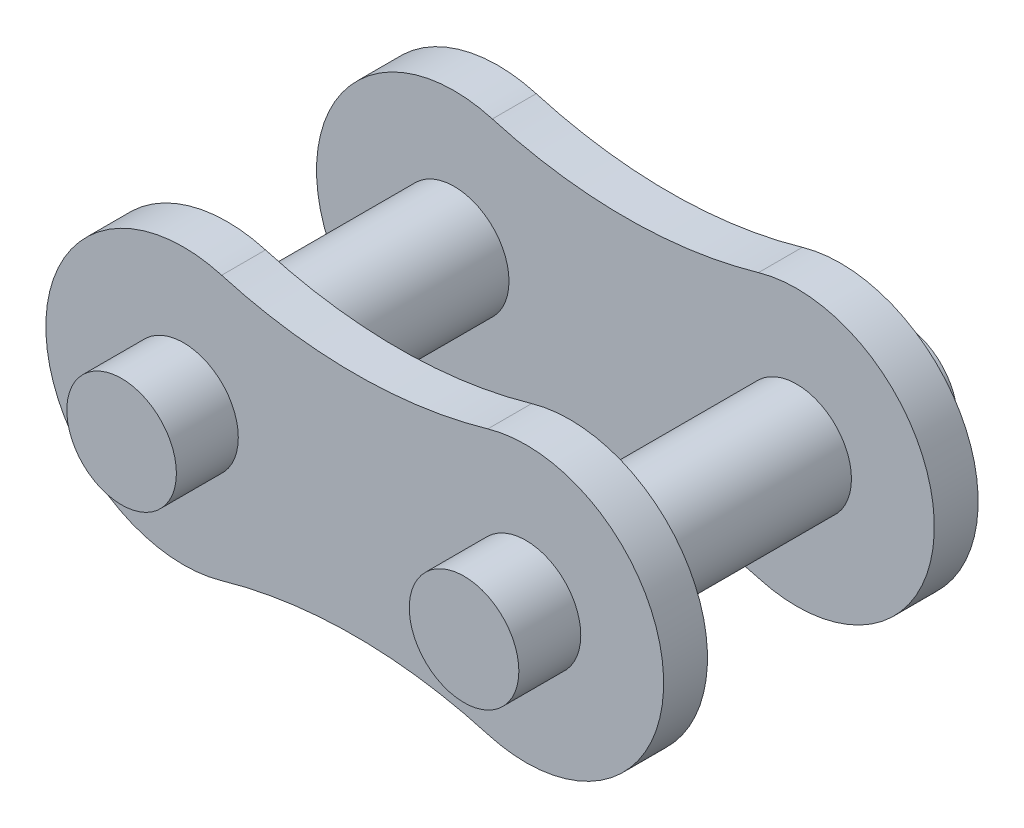
ISO-10303-21;
HEADER;
FILE_DESCRIPTION(('STEP AP214'),'2;1');
FILE_NAME('part.step','',(''),(''),'','','');
FILE_SCHEMA(('AUTOMOTIVE_DESIGN { 1 0 10303 214 1 1 1 1 }'));
ENDSEC;
DATA;
#1=APPLICATION_CONTEXT('core data for automotive mechanical design processes');
#2=APPLICATION_PROTOCOL_DEFINITION('international standard','automotive_design',2000,#1);
#3=PRODUCT_CONTEXT('',#1,'mechanical');
#4=PRODUCT('Part','Part','',(#3));
#5=PRODUCT_RELATED_PRODUCT_CATEGORY('part','',(#4));
#6=PRODUCT_DEFINITION_FORMATION('','',#4);
#7=PRODUCT_DEFINITION_CONTEXT('part definition',#1,'design');
#8=PRODUCT_DEFINITION('design','',#6,#7);
#9=PRODUCT_DEFINITION_SHAPE('','',#8);
#10=(LENGTH_UNIT() NAMED_UNIT(*) SI_UNIT(.MILLI.,.METRE.));
#11=(NAMED_UNIT(*) PLANE_ANGLE_UNIT() SI_UNIT($,.RADIAN.));
#12=(NAMED_UNIT(*) SI_UNIT($,.STERADIAN.) SOLID_ANGLE_UNIT());
#13=UNCERTAINTY_MEASURE_WITH_UNIT(LENGTH_MEASURE(1.E-05),#10,'distance_accuracy_value','');
#14=(GEOMETRIC_REPRESENTATION_CONTEXT(3) GLOBAL_UNCERTAINTY_ASSIGNED_CONTEXT((#13)) GLOBAL_UNIT_ASSIGNED_CONTEXT((#10,
#11,#12)) REPRESENTATION_CONTEXT('',''));
#15=CARTESIAN_POINT('',(0.,0.,0.));
#16=DIRECTION('',(0.,0.,1.));
#17=DIRECTION('',(1.,0.,0.));
#18=AXIS2_PLACEMENT_3D('',#15,#16,#17);
#19=CARTESIAN_POINT('',(23.8125,0.,10.16));
#20=DIRECTION('',(0.,0.,-1.));
#21=DIRECTION('',(-1.,0.,0.));
#22=AXIS2_PLACEMENT_3D('',#19,#20,#21);
#23=CYLINDRICAL_SURFACE('',#22,2.54);
#24=CARTESIAN_POINT('',(23.8125,0.,10.16));
#25=DIRECTION('',(0.,0.,1.));
#26=DIRECTION('',(1.,0.,0.));
#27=AXIS2_PLACEMENT_3D('',#24,#25,#26);
#28=CIRCLE('',#27,2.54);
#29=CARTESIAN_POINT('',(26.3525,0.,10.16));
#30=VERTEX_POINT('',#29);
#31=EDGE_CURVE('E11',#30,#30,#28,.T.);
#32=ORIENTED_EDGE('',*,*,#31,.F.);
#33=EDGE_LOOP('',(#32));
#34=FACE_BOUND('',#33,.T.);
#35=CARTESIAN_POINT('',(23.8125,0.,-10.16));
#36=DIRECTION('',(0.,0.,1.));
#37=DIRECTION('',(1.,0.,0.));
#38=AXIS2_PLACEMENT_3D('',#35,#36,#37);
#39=CIRCLE('',#38,2.54);
#40=CARTESIAN_POINT('',(26.3525,0.,-10.16));
#41=VERTEX_POINT('',#40);
#42=EDGE_CURVE('E50',#41,#41,#39,.T.);
#43=ORIENTED_EDGE('',*,*,#42,.T.);
#44=EDGE_LOOP('',(#43));
#45=FACE_BOUND('',#44,.T.);
#46=ADVANCED_FACE('F44',(#34,#45),#23,.T.);
#47=CARTESIAN_POINT('',(23.8125,0.,10.16));
#48=DIRECTION('',(0.,0.,1.));
#49=DIRECTION('',(1.,0.,0.));
#50=AXIS2_PLACEMENT_3D('',#47,#48,#49);
#51=PLANE('',#50);
#52=ORIENTED_EDGE('',*,*,#31,.T.);
#53=EDGE_LOOP('',(#52));
#54=FACE_BOUND('',#53,.T.);
#55=ADVANCED_FACE('F59',(#54),#51,.T.);
#56=CARTESIAN_POINT('',(23.8125,0.,-10.16));
#57=DIRECTION('',(0.,0.,1.));
#58=DIRECTION('',(1.,0.,0.));
#59=AXIS2_PLACEMENT_3D('',#56,#57,#58);
#60=PLANE('',#59);
#61=ORIENTED_EDGE('',*,*,#42,.F.);
#62=EDGE_LOOP('',(#61));
#63=FACE_BOUND('',#62,.T.);
#64=ADVANCED_FACE('F57',(#63),#60,.F.);
#65=CLOSED_SHELL('',(#46,#55,#64));
#66=MANIFOLD_SOLID_BREP('B2',#65);
#67=CARTESIAN_POINT('',(7.9375,0.,10.16));
#68=DIRECTION('',(0.,0.,-1.));
#69=DIRECTION('',(-1.,0.,0.));
#70=AXIS2_PLACEMENT_3D('',#67,#68,#69);
#71=CYLINDRICAL_SURFACE('',#70,2.54);
#72=CARTESIAN_POINT('',(7.9375,0.,10.16));
#73=DIRECTION('',(0.,0.,1.));
#74=DIRECTION('',(1.,0.,0.));
#75=AXIS2_PLACEMENT_3D('',#72,#73,#74);
#76=CIRCLE('',#75,2.54);
#77=CARTESIAN_POINT('',(10.4775,0.,10.16));
#78=VERTEX_POINT('',#77);
#79=EDGE_CURVE('E43',#78,#78,#76,.T.);
#80=ORIENTED_EDGE('',*,*,#79,.F.);
#81=EDGE_LOOP('',(#80));
#82=FACE_BOUND('',#81,.T.);
#83=CARTESIAN_POINT('',(7.9375,0.,-10.16));
#84=DIRECTION('',(0.,0.,1.));
#85=DIRECTION('',(1.,0.,0.));
#86=AXIS2_PLACEMENT_3D('',#83,#84,#85);
#87=CIRCLE('',#86,2.54);
#88=CARTESIAN_POINT('',(10.4775,0.,-10.16));
#89=VERTEX_POINT('',#88);
#90=EDGE_CURVE('E107',#89,#89,#87,.T.);
#91=ORIENTED_EDGE('',*,*,#90,.T.);
#92=EDGE_LOOP('',(#91));
#93=FACE_BOUND('',#92,.T.);
#94=ADVANCED_FACE('F101',(#82,#93),#71,.T.);
#95=CARTESIAN_POINT('',(7.9375,0.,10.16));
#96=DIRECTION('',(0.,0.,1.));
#97=DIRECTION('',(1.,0.,0.));
#98=AXIS2_PLACEMENT_3D('',#95,#96,#97);
#99=PLANE('',#98);
#100=ORIENTED_EDGE('',*,*,#79,.T.);
#101=EDGE_LOOP('',(#100));
#102=FACE_BOUND('',#101,.T.);
#103=ADVANCED_FACE('F116',(#102),#99,.T.);
#104=CARTESIAN_POINT('',(7.9375,0.,-10.16));
#105=DIRECTION('',(0.,0.,1.));
#106=DIRECTION('',(1.,0.,0.));
#107=AXIS2_PLACEMENT_3D('',#104,#105,#106);
#108=PLANE('',#107);
#109=ORIENTED_EDGE('',*,*,#90,.F.);
#110=EDGE_LOOP('',(#109));
#111=FACE_BOUND('',#110,.T.);
#112=ADVANCED_FACE('F114',(#111),#108,.F.);
#113=CLOSED_SHELL('',(#94,#103,#112));
#114=MANIFOLD_SOLID_BREP('B6',#113);
#115=CARTESIAN_POINT('',(15.875,27.5120568641382,7.2898));
#116=DIRECTION('',(0.,0.,-1.));
#117=DIRECTION('',(1.,0.,0.));
#118=AXIS2_PLACEMENT_3D('',#115,#116,#117);
#119=CYLINDRICAL_SURFACE('',#118,22.2526999751897);
#120=CARTESIAN_POINT('',(15.875,27.5120568641382,5.2578));
#121=DIRECTION('',(0.,0.,-1.));
#122=DIRECTION('',(1.,0.,0.));
#123=AXIS2_PLACEMENT_3D('',#120,#121,#122);
#124=CIRCLE('',#123,22.2526999751897);
#125=CARTESIAN_POINT('',(22.0435268273679,6.13141297846786,5.2578));
#126=VERTEX_POINT('',#125);
#127=CARTESIAN_POINT('',(9.70647317263207,6.13141297846786,5.2578));
#128=VERTEX_POINT('',#127);
#129=EDGE_CURVE('E221',#126,#128,#124,.T.);
#130=ORIENTED_EDGE('',*,*,#129,.T.);
#131=DIRECTION('',(0.,0.,-1.));
#132=VECTOR('',#131,1.);
#133=CARTESIAN_POINT('',(9.70647317263207,6.13141297846786,7.2898));
#134=LINE('',#133,#132);
#135=CARTESIAN_POINT('',(9.70647317263207,6.13141297846786,7.2898));
#136=VERTEX_POINT('',#135);
#137=EDGE_CURVE('E160',#136,#128,#134,.T.);
#138=ORIENTED_EDGE('',*,*,#137,.F.);
#139=CARTESIAN_POINT('',(15.875,27.5120568641382,7.2898));
#140=DIRECTION('',(0.,0.,-1.));
#141=DIRECTION('',(1.,0.,0.));
#142=AXIS2_PLACEMENT_3D('',#139,#140,#141);
#143=CIRCLE('',#142,22.2526999751897);
#144=CARTESIAN_POINT('',(22.0435268273679,6.13141297846786,7.2898));
#145=VERTEX_POINT('',#144);
#146=EDGE_CURVE('E210',#145,#136,#143,.T.);
#147=ORIENTED_EDGE('',*,*,#146,.F.);
#148=DIRECTION('',(0.,0.,-1.));
#149=VECTOR('',#148,1.);
#150=CARTESIAN_POINT('',(22.0435268273679,6.13141297846786,7.2898));
#151=LINE('',#150,#149);
#152=EDGE_CURVE('E99',#145,#126,#151,.T.);
#153=ORIENTED_EDGE('',*,*,#152,.T.);
#154=EDGE_LOOP('',(#130,#138,#147,#153));
#155=FACE_BOUND('',#154,.T.);
#156=ADVANCED_FACE('F157',(#155),#119,.F.);
#157=CARTESIAN_POINT('',(23.8125,0.,7.2898));
#158=DIRECTION('',(0.,0.,-1.));
#159=DIRECTION('',(1.,0.,0.));
#160=AXIS2_PLACEMENT_3D('',#157,#158,#159);
#161=CYLINDRICAL_SURFACE('',#160,6.38149600000001);
#162=CARTESIAN_POINT('',(23.8125,0.,5.2578));
#163=DIRECTION('',(0.,0.,1.));
#164=DIRECTION('',(1.,0.,0.));
#165=AXIS2_PLACEMENT_3D('',#162,#163,#164);
#166=CIRCLE('',#165,6.38149600000001);
#167=CARTESIAN_POINT('',(22.0435268273679,-6.13141297846786,5.2578));
#168=VERTEX_POINT('',#167);
#169=EDGE_CURVE('E198',#168,#126,#166,.T.);
#170=ORIENTED_EDGE('',*,*,#169,.T.);
#171=ORIENTED_EDGE('',*,*,#152,.F.);
#172=CARTESIAN_POINT('',(23.8125,0.,7.2898));
#173=DIRECTION('',(0.,0.,1.));
#174=DIRECTION('',(1.,0.,0.));
#175=AXIS2_PLACEMENT_3D('',#172,#173,#174);
#176=CIRCLE('',#175,6.38149600000001);
#177=CARTESIAN_POINT('',(22.0435268273679,-6.13141297846786,7.2898));
#178=VERTEX_POINT('',#177);
#179=EDGE_CURVE('E175',#178,#145,#176,.T.);
#180=ORIENTED_EDGE('',*,*,#179,.F.);
#181=DIRECTION('',(0.,0.,-1.));
#182=VECTOR('',#181,1.);
#183=CARTESIAN_POINT('',(22.0435268273679,-6.13141297846786,7.2898));
#184=LINE('',#183,#182);
#185=EDGE_CURVE('E166',#178,#168,#184,.T.);
#186=ORIENTED_EDGE('',*,*,#185,.T.);
#187=EDGE_LOOP('',(#170,#171,#180,#186));
#188=FACE_BOUND('',#187,.T.);
#189=ADVANCED_FACE('F228',(#188),#161,.T.);
#190=CARTESIAN_POINT('',(15.875,-27.5120568641382,7.2898));
#191=DIRECTION('',(0.,0.,-1.));
#192=DIRECTION('',(1.,0.,0.));
#193=AXIS2_PLACEMENT_3D('',#190,#191,#192);
#194=CYLINDRICAL_SURFACE('',#193,22.2526999751897);
#195=CARTESIAN_POINT('',(15.875,-27.5120568641382,5.2578));
#196=DIRECTION('',(0.,0.,-1.));
#197=DIRECTION('',(-1.,0.,0.));
#198=AXIS2_PLACEMENT_3D('',#195,#196,#197);
#199=CIRCLE('',#198,22.2526999751897);
#200=CARTESIAN_POINT('',(9.70647317263207,-6.13141297846786,5.2578));
#201=VERTEX_POINT('',#200);
#202=EDGE_CURVE('E192',#201,#168,#199,.T.);
#203=ORIENTED_EDGE('',*,*,#202,.T.);
#204=ORIENTED_EDGE('',*,*,#185,.F.);
#205=CARTESIAN_POINT('',(15.875,-27.5120568641382,7.2898));
#206=DIRECTION('',(0.,0.,-1.));
#207=DIRECTION('',(-1.,0.,0.));
#208=AXIS2_PLACEMENT_3D('',#205,#206,#207);
#209=CIRCLE('',#208,22.2526999751897);
#210=CARTESIAN_POINT('',(9.70647317263207,-6.13141297846786,7.2898));
#211=VERTEX_POINT('',#210);
#212=EDGE_CURVE('E208',#211,#178,#209,.T.);
#213=ORIENTED_EDGE('',*,*,#212,.F.);
#214=DIRECTION('',(0.,0.,-1.));
#215=VECTOR('',#214,1.);
#216=CARTESIAN_POINT('',(9.70647317263207,-6.13141297846786,7.2898));
#217=LINE('',#216,#215);
#218=EDGE_CURVE('E213',#211,#201,#217,.T.);
#219=ORIENTED_EDGE('',*,*,#218,.T.);
#220=EDGE_LOOP('',(#203,#204,#213,#219));
#221=FACE_BOUND('',#220,.T.);
#222=ADVANCED_FACE('F216',(#221),#194,.F.);
#223=CARTESIAN_POINT('',(7.9375,0.,7.2898));
#224=DIRECTION('',(0.,0.,-1.));
#225=DIRECTION('',(1.,0.,0.));
#226=AXIS2_PLACEMENT_3D('',#223,#224,#225);
#227=CYLINDRICAL_SURFACE('',#226,6.38149600000001);
#228=CARTESIAN_POINT('',(7.9375,0.,5.2578));
#229=DIRECTION('',(0.,0.,1.));
#230=DIRECTION('',(1.,0.,0.));
#231=AXIS2_PLACEMENT_3D('',#228,#229,#230);
#232=CIRCLE('',#231,6.38149600000001);
#233=EDGE_CURVE('E215',#128,#201,#232,.T.);
#234=ORIENTED_EDGE('',*,*,#233,.T.);
#235=ORIENTED_EDGE('',*,*,#218,.F.);
#236=CARTESIAN_POINT('',(7.9375,0.,7.2898));
#237=DIRECTION('',(0.,0.,1.));
#238=DIRECTION('',(1.,0.,0.));
#239=AXIS2_PLACEMENT_3D('',#236,#237,#238);
#240=CIRCLE('',#239,6.38149600000001);
#241=EDGE_CURVE('E205',#136,#211,#240,.T.);
#242=ORIENTED_EDGE('',*,*,#241,.F.);
#243=ORIENTED_EDGE('',*,*,#137,.T.);
#244=EDGE_LOOP('',(#234,#235,#242,#243));
#245=FACE_BOUND('',#244,.T.);
#246=ADVANCED_FACE('F214',(#245),#227,.T.);
#247=CARTESIAN_POINT('',(19.84375,13.7560284320691,7.2898));
#248=DIRECTION('',(0.,0.,-1.));
#249=DIRECTION('',(1.,0.,0.));
#250=AXIS2_PLACEMENT_3D('',#247,#248,#249);
#251=PLANE('',#250);
#252=CARTESIAN_POINT('',(23.8125,0.,7.2898));
#253=DIRECTION('',(0.,0.,1.));
#254=DIRECTION('',(1.,0.,0.));
#255=AXIS2_PLACEMENT_3D('',#252,#253,#254);
#256=CIRCLE('',#255,2.54);
#257=CARTESIAN_POINT('',(26.3525,0.,7.2898));
#258=VERTEX_POINT('',#257);
#259=EDGE_CURVE('E237',#258,#258,#256,.T.);
#260=ORIENTED_EDGE('',*,*,#259,.F.);
#261=EDGE_LOOP('',(#260));
#262=FACE_BOUND('',#261,.T.);
#263=CARTESIAN_POINT('',(7.9375,0.,7.2898));
#264=DIRECTION('',(0.,0.,1.));
#265=DIRECTION('',(1.,0.,0.));
#266=AXIS2_PLACEMENT_3D('',#263,#264,#265);
#267=CIRCLE('',#266,2.54);
#268=CARTESIAN_POINT('',(10.4775,0.,7.2898));
#269=VERTEX_POINT('',#268);
#270=EDGE_CURVE('E224',#269,#269,#267,.T.);
#271=ORIENTED_EDGE('',*,*,#270,.F.);
#272=EDGE_LOOP('',(#271));
#273=FACE_BOUND('',#272,.T.);
#274=ORIENTED_EDGE('',*,*,#146,.T.);
#275=ORIENTED_EDGE('',*,*,#241,.T.);
#276=ORIENTED_EDGE('',*,*,#212,.T.);
#277=ORIENTED_EDGE('',*,*,#179,.T.);
#278=EDGE_LOOP('',(#274,#275,#276,#277));
#279=FACE_BOUND('',#278,.T.);
#280=ADVANCED_FACE('F206',(#262,#273,#279),#251,.F.);
#281=CARTESIAN_POINT('',(19.84375,13.7560284320691,5.2578));
#282=DIRECTION('',(0.,0.,-1.));
#283=DIRECTION('',(1.,0.,0.));
#284=AXIS2_PLACEMENT_3D('',#281,#282,#283);
#285=PLANE('',#284);
#286=CARTESIAN_POINT('',(23.8125,0.,5.2578));
#287=DIRECTION('',(0.,0.,1.));
#288=DIRECTION('',(1.,0.,0.));
#289=AXIS2_PLACEMENT_3D('',#286,#287,#288);
#290=CIRCLE('',#289,2.54);
#291=CARTESIAN_POINT('',(26.3525,0.,5.2578));
#292=VERTEX_POINT('',#291);
#293=EDGE_CURVE('E240',#292,#292,#290,.T.);
#294=ORIENTED_EDGE('',*,*,#293,.T.);
#295=EDGE_LOOP('',(#294));
#296=FACE_BOUND('',#295,.T.);
#297=CARTESIAN_POINT('',(7.9375,0.,5.2578));
#298=DIRECTION('',(0.,0.,1.));
#299=DIRECTION('',(1.,0.,0.));
#300=AXIS2_PLACEMENT_3D('',#297,#298,#299);
#301=CIRCLE('',#300,2.54);
#302=CARTESIAN_POINT('',(10.4775,0.,5.2578));
#303=VERTEX_POINT('',#302);
#304=EDGE_CURVE('E234',#303,#303,#301,.T.);
#305=ORIENTED_EDGE('',*,*,#304,.T.);
#306=EDGE_LOOP('',(#305));
#307=FACE_BOUND('',#306,.T.);
#308=ORIENTED_EDGE('',*,*,#129,.F.);
#309=ORIENTED_EDGE('',*,*,#169,.F.);
#310=ORIENTED_EDGE('',*,*,#202,.F.);
#311=ORIENTED_EDGE('',*,*,#233,.F.);
#312=EDGE_LOOP('',(#308,#309,#310,#311));
#313=FACE_BOUND('',#312,.T.);
#314=ADVANCED_FACE('F231',(#296,#307,#313),#285,.T.);
#315=CARTESIAN_POINT('',(7.9375,0.,7.2898));
#316=DIRECTION('',(0.,0.,-1.));
#317=DIRECTION('',(1.,0.,0.));
#318=AXIS2_PLACEMENT_3D('',#315,#316,#317);
#319=CYLINDRICAL_SURFACE('',#318,2.54);
#320=ORIENTED_EDGE('',*,*,#270,.T.);
#321=EDGE_LOOP('',(#320));
#322=FACE_BOUND('',#321,.T.);
#323=ORIENTED_EDGE('',*,*,#304,.F.);
#324=EDGE_LOOP('',(#323));
#325=FACE_BOUND('',#324,.T.);
#326=ADVANCED_FACE('F254',(#322,#325),#319,.F.);
#327=CARTESIAN_POINT('',(23.8125,0.,7.2898));
#328=DIRECTION('',(0.,0.,-1.));
#329=DIRECTION('',(1.,0.,0.));
#330=AXIS2_PLACEMENT_3D('',#327,#328,#329);
#331=CYLINDRICAL_SURFACE('',#330,2.54);
#332=ORIENTED_EDGE('',*,*,#259,.T.);
#333=EDGE_LOOP('',(#332));
#334=FACE_BOUND('',#333,.T.);
#335=ORIENTED_EDGE('',*,*,#293,.F.);
#336=EDGE_LOOP('',(#335));
#337=FACE_BOUND('',#336,.T.);
#338=ADVANCED_FACE('F246',(#334,#337),#331,.F.);
#339=CLOSED_SHELL('',(#156,#189,#222,#246,#280,#314,#326,#338));
#340=MANIFOLD_SOLID_BREP('B38',#339);
#341=CARTESIAN_POINT('',(15.875,27.5120568641382,-7.2898));
#342=DIRECTION('',(0.,0.,1.));
#343=DIRECTION('',(1.,0.,0.));
#344=AXIS2_PLACEMENT_3D('',#341,#342,#343);
#345=CYLINDRICAL_SURFACE('',#344,22.2526999751897);
#346=CARTESIAN_POINT('',(15.875,27.5120568641382,-5.2578));
#347=DIRECTION('',(0.,0.,-1.));
#348=DIRECTION('',(1.,0.,0.));
#349=AXIS2_PLACEMENT_3D('',#346,#347,#348);
#350=CIRCLE('',#349,22.2526999751897);
#351=CARTESIAN_POINT('',(22.0435268273679,6.13141297846786,-5.2578));
#352=VERTEX_POINT('',#351);
#353=CARTESIAN_POINT('',(9.70647317263207,6.13141297846786,-5.2578));
#354=VERTEX_POINT('',#353);
#355=EDGE_CURVE('E404',#352,#354,#350,.T.);
#356=ORIENTED_EDGE('',*,*,#355,.F.);
#357=DIRECTION('',(0.,0.,1.));
#358=VECTOR('',#357,1.);
#359=CARTESIAN_POINT('',(22.0435268273679,6.13141297846786,-7.2898));
#360=LINE('',#359,#358);
#361=CARTESIAN_POINT('',(22.0435268273679,6.13141297846786,-7.2898));
#362=VERTEX_POINT('',#361);
#363=EDGE_CURVE('E155',#362,#352,#360,.T.);
#364=ORIENTED_EDGE('',*,*,#363,.F.);
#365=CARTESIAN_POINT('',(15.875,27.5120568641382,-7.2898));
#366=DIRECTION('',(0.,0.,-1.));
#367=DIRECTION('',(1.,0.,0.));
#368=AXIS2_PLACEMENT_3D('',#365,#366,#367);
#369=CIRCLE('',#368,22.2526999751897);
#370=CARTESIAN_POINT('',(9.70647317263207,6.13141297846786,-7.2898));
#371=VERTEX_POINT('',#370);
#372=EDGE_CURVE('E397',#362,#371,#369,.T.);
#373=ORIENTED_EDGE('',*,*,#372,.T.);
#374=DIRECTION('',(0.,0.,1.));
#375=VECTOR('',#374,1.);
#376=CARTESIAN_POINT('',(9.70647317263207,6.13141297846786,-7.2898));
#377=LINE('',#376,#375);
#378=EDGE_CURVE('E342',#371,#354,#377,.T.);
#379=ORIENTED_EDGE('',*,*,#378,.T.);
#380=EDGE_LOOP('',(#356,#364,#373,#379));
#381=FACE_BOUND('',#380,.T.);
#382=ADVANCED_FACE('F339',(#381),#345,.F.);
#383=CARTESIAN_POINT('',(23.8125,0.,-7.2898));
#384=DIRECTION('',(0.,0.,1.));
#385=DIRECTION('',(1.,0.,0.));
#386=AXIS2_PLACEMENT_3D('',#383,#384,#385);
#387=CYLINDRICAL_SURFACE('',#386,6.38149600000001);
#388=CARTESIAN_POINT('',(23.8125,0.,-5.2578));
#389=DIRECTION('',(0.,0.,1.));
#390=DIRECTION('',(1.,0.,0.));
#391=AXIS2_PLACEMENT_3D('',#388,#389,#390);
#392=CIRCLE('',#391,6.38149600000001);
#393=CARTESIAN_POINT('',(22.0435268273679,-6.13141297846786,-5.2578));
#394=VERTEX_POINT('',#393);
#395=EDGE_CURVE('E399',#394,#352,#392,.T.);
#396=ORIENTED_EDGE('',*,*,#395,.F.);
#397=DIRECTION('',(0.,0.,1.));
#398=VECTOR('',#397,1.);
#399=CARTESIAN_POINT('',(22.0435268273679,-6.13141297846786,-7.2898));
#400=LINE('',#399,#398);
#401=CARTESIAN_POINT('',(22.0435268273679,-6.13141297846786,-7.2898));
#402=VERTEX_POINT('',#401);
#403=EDGE_CURVE('E348',#402,#394,#400,.T.);
#404=ORIENTED_EDGE('',*,*,#403,.F.);
#405=CARTESIAN_POINT('',(23.8125,0.,-7.2898));
#406=DIRECTION('',(0.,0.,1.));
#407=DIRECTION('',(1.,0.,0.));
#408=AXIS2_PLACEMENT_3D('',#405,#406,#407);
#409=CIRCLE('',#408,6.38149600000001);
#410=EDGE_CURVE('E394',#402,#362,#409,.T.);
#411=ORIENTED_EDGE('',*,*,#410,.T.);
#412=ORIENTED_EDGE('',*,*,#363,.T.);
#413=EDGE_LOOP('',(#396,#404,#411,#412));
#414=FACE_BOUND('',#413,.T.);
#415=ADVANCED_FACE('F415',(#414),#387,.T.);
#416=CARTESIAN_POINT('',(15.875,-27.5120568641382,-7.2898));
#417=DIRECTION('',(0.,0.,1.));
#418=DIRECTION('',(1.,0.,0.));
#419=AXIS2_PLACEMENT_3D('',#416,#417,#418);
#420=CYLINDRICAL_SURFACE('',#419,22.2526999751897);
#421=CARTESIAN_POINT('',(15.875,-27.5120568641382,-5.2578));
#422=DIRECTION('',(0.,0.,-1.));
#423=DIRECTION('',(-1.,0.,0.));
#424=AXIS2_PLACEMENT_3D('',#421,#422,#423);
#425=CIRCLE('',#424,22.2526999751897);
#426=CARTESIAN_POINT('',(9.70647317263207,-6.13141297846786,-5.2578));
#427=VERTEX_POINT('',#426);
#428=EDGE_CURVE('E389',#427,#394,#425,.T.);
#429=ORIENTED_EDGE('',*,*,#428,.F.);
#430=DIRECTION('',(0.,0.,1.));
#431=VECTOR('',#430,1.);
#432=CARTESIAN_POINT('',(9.70647317263207,-6.13141297846786,-7.2898));
#433=LINE('',#432,#431);
#434=CARTESIAN_POINT('',(9.70647317263207,-6.13141297846786,-7.2898));
#435=VERTEX_POINT('',#434);
#436=EDGE_CURVE('E384',#435,#427,#433,.T.);
#437=ORIENTED_EDGE('',*,*,#436,.F.);
#438=CARTESIAN_POINT('',(15.875,-27.5120568641382,-7.2898));
#439=DIRECTION('',(0.,0.,-1.));
#440=DIRECTION('',(-1.,0.,0.));
#441=AXIS2_PLACEMENT_3D('',#438,#439,#440);
#442=CIRCLE('',#441,22.2526999751897);
#443=EDGE_CURVE('E387',#435,#402,#442,.T.);
#444=ORIENTED_EDGE('',*,*,#443,.T.);
#445=ORIENTED_EDGE('',*,*,#403,.T.);
#446=EDGE_LOOP('',(#429,#437,#444,#445));
#447=FACE_BOUND('',#446,.T.);
#448=ADVANCED_FACE('F386',(#447),#420,.F.);
#449=CARTESIAN_POINT('',(7.9375,0.,-7.2898));
#450=DIRECTION('',(0.,0.,1.));
#451=DIRECTION('',(1.,0.,0.));
#452=AXIS2_PLACEMENT_3D('',#449,#450,#451);
#453=CYLINDRICAL_SURFACE('',#452,6.38149600000001);
#454=CARTESIAN_POINT('',(7.9375,0.,-5.2578));
#455=DIRECTION('',(0.,0.,1.));
#456=DIRECTION('',(1.,0.,0.));
#457=AXIS2_PLACEMENT_3D('',#454,#455,#456);
#458=CIRCLE('',#457,6.38149600000001);
#459=EDGE_CURVE('E407',#354,#427,#458,.T.);
#460=ORIENTED_EDGE('',*,*,#459,.F.);
#461=ORIENTED_EDGE('',*,*,#378,.F.);
#462=CARTESIAN_POINT('',(7.9375,0.,-7.2898));
#463=DIRECTION('',(0.,0.,1.));
#464=DIRECTION('',(1.,0.,0.));
#465=AXIS2_PLACEMENT_3D('',#462,#463,#464);
#466=CIRCLE('',#465,6.38149600000001);
#467=EDGE_CURVE('E393',#371,#435,#466,.T.);
#468=ORIENTED_EDGE('',*,*,#467,.T.);
#469=ORIENTED_EDGE('',*,*,#436,.T.);
#470=EDGE_LOOP('',(#460,#461,#468,#469));
#471=FACE_BOUND('',#470,.T.);
#472=ADVANCED_FACE('F396',(#471),#453,.T.);
#473=CARTESIAN_POINT('',(19.84375,13.7560284320691,-7.2898));
#474=DIRECTION('',(0.,0.,1.));
#475=DIRECTION('',(1.,0.,0.));
#476=AXIS2_PLACEMENT_3D('',#473,#474,#475);
#477=PLANE('',#476);
#478=CARTESIAN_POINT('',(23.8125,0.,-7.2898));
#479=DIRECTION('',(0.,0.,1.));
#480=DIRECTION('',(1.,0.,0.));
#481=AXIS2_PLACEMENT_3D('',#478,#479,#480);
#482=CIRCLE('',#481,2.54);
#483=CARTESIAN_POINT('',(26.3525,0.,-7.2898));
#484=VERTEX_POINT('',#483);
#485=EDGE_CURVE('E448',#484,#484,#482,.T.);
#486=ORIENTED_EDGE('',*,*,#485,.T.);
#487=EDGE_LOOP('',(#486));
#488=FACE_BOUND('',#487,.T.);
#489=CARTESIAN_POINT('',(7.9375,0.,-7.2898));
#490=DIRECTION('',(0.,0.,1.));
#491=DIRECTION('',(1.,0.,0.));
#492=AXIS2_PLACEMENT_3D('',#489,#490,#491);
#493=CIRCLE('',#492,2.54);
#494=CARTESIAN_POINT('',(10.4775,0.,-7.2898));
#495=VERTEX_POINT('',#494);
#496=EDGE_CURVE('E408',#495,#495,#493,.T.);
#497=ORIENTED_EDGE('',*,*,#496,.T.);
#498=EDGE_LOOP('',(#497));
#499=FACE_BOUND('',#498,.T.);
#500=ORIENTED_EDGE('',*,*,#372,.F.);
#501=ORIENTED_EDGE('',*,*,#410,.F.);
#502=ORIENTED_EDGE('',*,*,#443,.F.);
#503=ORIENTED_EDGE('',*,*,#467,.F.);
#504=EDGE_LOOP('',(#500,#501,#502,#503));
#505=FACE_BOUND('',#504,.T.);
#506=ADVANCED_FACE('F392',(#488,#499,#505),#477,.F.);
#507=CARTESIAN_POINT('',(19.84375,13.7560284320691,-5.2578));
#508=DIRECTION('',(0.,0.,1.));
#509=DIRECTION('',(1.,0.,0.));
#510=AXIS2_PLACEMENT_3D('',#507,#508,#509);
#511=PLANE('',#510);
#512=CARTESIAN_POINT('',(23.8125,0.,-5.2578));
#513=DIRECTION('',(0.,0.,1.));
#514=DIRECTION('',(1.,0.,0.));
#515=AXIS2_PLACEMENT_3D('',#512,#513,#514);
#516=CIRCLE('',#515,2.54);
#517=CARTESIAN_POINT('',(26.3525,0.,-5.2578));
#518=VERTEX_POINT('',#517);
#519=EDGE_CURVE('E451',#518,#518,#516,.T.);
#520=ORIENTED_EDGE('',*,*,#519,.F.);
#521=EDGE_LOOP('',(#520));
#522=FACE_BOUND('',#521,.T.);
#523=CARTESIAN_POINT('',(7.9375,0.,-5.2578));
#524=DIRECTION('',(0.,0.,1.));
#525=DIRECTION('',(1.,0.,0.));
#526=AXIS2_PLACEMENT_3D('',#523,#524,#525);
#527=CIRCLE('',#526,2.54);
#528=CARTESIAN_POINT('',(10.4775,0.,-5.2578));
#529=VERTEX_POINT('',#528);
#530=EDGE_CURVE('E453',#529,#529,#527,.T.);
#531=ORIENTED_EDGE('',*,*,#530,.F.);
#532=EDGE_LOOP('',(#531));
#533=FACE_BOUND('',#532,.T.);
#534=ORIENTED_EDGE('',*,*,#355,.T.);
#535=ORIENTED_EDGE('',*,*,#459,.T.);
#536=ORIENTED_EDGE('',*,*,#428,.T.);
#537=ORIENTED_EDGE('',*,*,#395,.T.);
#538=EDGE_LOOP('',(#534,#535,#536,#537));
#539=FACE_BOUND('',#538,.T.);
#540=ADVANCED_FACE('F414',(#522,#533,#539),#511,.T.);
#541=CARTESIAN_POINT('',(7.9375,0.,-7.2898));
#542=DIRECTION('',(0.,0.,1.));
#543=DIRECTION('',(1.,0.,0.));
#544=AXIS2_PLACEMENT_3D('',#541,#542,#543);
#545=CYLINDRICAL_SURFACE('',#544,2.54);
#546=ORIENTED_EDGE('',*,*,#496,.F.);
#547=EDGE_LOOP('',(#546));
#548=FACE_BOUND('',#547,.T.);
#549=ORIENTED_EDGE('',*,*,#530,.T.);
#550=EDGE_LOOP('',(#549));
#551=FACE_BOUND('',#550,.T.);
#552=ADVANCED_FACE('F433',(#548,#551),#545,.F.);
#553=CARTESIAN_POINT('',(23.8125,0.,-7.2898));
#554=DIRECTION('',(0.,0.,1.));
#555=DIRECTION('',(1.,0.,0.));
#556=AXIS2_PLACEMENT_3D('',#553,#554,#555);
#557=CYLINDRICAL_SURFACE('',#556,2.54);
#558=ORIENTED_EDGE('',*,*,#485,.F.);
#559=EDGE_LOOP('',(#558));
#560=FACE_BOUND('',#559,.T.);
#561=ORIENTED_EDGE('',*,*,#519,.T.);
#562=EDGE_LOOP('',(#561));
#563=FACE_BOUND('',#562,.T.);
#564=ADVANCED_FACE('F440',(#560,#563),#557,.F.);
#565=CLOSED_SHELL('',(#382,#415,#448,#472,#506,#540,#552,#564));
#566=MANIFOLD_SOLID_BREP('B93',#565);
#567=ADVANCED_BREP_SHAPE_REPRESENTATION('',(#18,#66,#114,#340,#566),#14);
#568=SHAPE_DEFINITION_REPRESENTATION(#9,#567);
ENDSEC;
END-ISO-10303-21;
